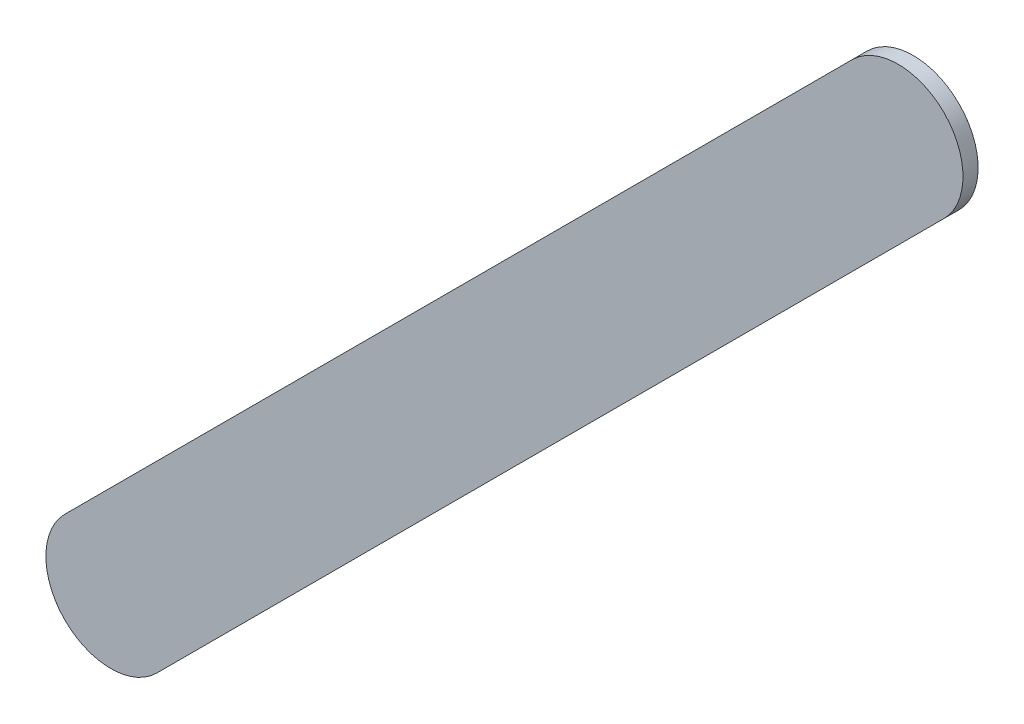
ISO-10303-21;
HEADER;
FILE_DESCRIPTION(('STEP AP214'),'2;1');
FILE_NAME('part.step','',(''),(''),'','','');
FILE_SCHEMA(('AUTOMOTIVE_DESIGN { 1 0 10303 214 1 1 1 1 }'));
ENDSEC;
DATA;
#1=APPLICATION_CONTEXT('core data for automotive mechanical design processes');
#2=APPLICATION_PROTOCOL_DEFINITION('international standard','automotive_design',2000,#1);
#3=PRODUCT_CONTEXT('',#1,'mechanical');
#4=PRODUCT('Part','Part','',(#3));
#5=PRODUCT_RELATED_PRODUCT_CATEGORY('part','',(#4));
#6=PRODUCT_DEFINITION_FORMATION('','',#4);
#7=PRODUCT_DEFINITION_CONTEXT('part definition',#1,'design');
#8=PRODUCT_DEFINITION('design','',#6,#7);
#9=PRODUCT_DEFINITION_SHAPE('','',#8);
#10=(LENGTH_UNIT() NAMED_UNIT(*) SI_UNIT(.MILLI.,.METRE.));
#11=(NAMED_UNIT(*) PLANE_ANGLE_UNIT() SI_UNIT($,.RADIAN.));
#12=(NAMED_UNIT(*) SI_UNIT($,.STERADIAN.) SOLID_ANGLE_UNIT());
#13=UNCERTAINTY_MEASURE_WITH_UNIT(LENGTH_MEASURE(1.E-05),#10,'distance_accuracy_value','');
#14=(GEOMETRIC_REPRESENTATION_CONTEXT(3) GLOBAL_UNCERTAINTY_ASSIGNED_CONTEXT((#13)) GLOBAL_UNIT_ASSIGNED_CONTEXT((#10,
#11,#12)) REPRESENTATION_CONTEXT('',''));
#15=CARTESIAN_POINT('',(0.,0.,0.));
#16=DIRECTION('',(0.,0.,1.));
#17=DIRECTION('',(1.,0.,0.));
#18=AXIS2_PLACEMENT_3D('',#15,#16,#17);
#19=CARTESIAN_POINT('',(148.076066,-54.846066,1.635));
#20=DIRECTION('',(0.,0.,1.));
#21=DIRECTION('',(1.,0.,0.));
#22=AXIS2_PLACEMENT_3D('',#19,#20,#21);
#23=PLANE('',#22);
#24=DIRECTION('',(0.707106781186548,0.707106781186548,0.));
#25=VECTOR('',#24,1.);
#26=CARTESIAN_POINT('',(148.076066,-54.846066,1.635));
#27=LINE('',#26,#25);
#28=CARTESIAN_POINT('',(148.076066,-54.846066,1.635));
#29=VERTEX_POINT('',#28);
#30=CARTESIAN_POINT('',(149.896067,-53.026065,1.635));
#31=VERTEX_POINT('',#30);
#32=EDGE_CURVE('E72',#29,#31,#27,.T.);
#33=ORIENTED_EDGE('',*,*,#32,.T.);
#34=CARTESIAN_POINT('',(149.7900005,-52.9199985,1.635));
#35=DIRECTION('',(0.,0.,1.));
#36=DIRECTION('',(0.707106781186548,-0.707106781186548,0.));
#37=AXIS2_PLACEMENT_3D('',#34,#35,#36);
#38=CIRCLE('',#37,0.150000682813);
#39=CARTESIAN_POINT('',(149.683934,-52.813932,1.635));
#40=VERTEX_POINT('',#39);
#41=EDGE_CURVE('E100',#31,#40,#38,.T.);
#42=ORIENTED_EDGE('',*,*,#41,.T.);
#43=DIRECTION('',(-0.707106781186548,-0.707106781186548,0.));
#44=VECTOR('',#43,1.);
#45=CARTESIAN_POINT('',(149.683934,-52.813932,1.635));
#46=LINE('',#45,#44);
#47=CARTESIAN_POINT('',(147.863933,-54.633933,1.635));
#48=VERTEX_POINT('',#47);
#49=EDGE_CURVE('E74',#40,#48,#46,.T.);
#50=ORIENTED_EDGE('',*,*,#49,.T.);
#51=CARTESIAN_POINT('',(147.9699995,-54.7399995,1.635));
#52=DIRECTION('',(0.,0.,1.));
#53=DIRECTION('',(-0.707106781186548,0.707106781186548,0.));
#54=AXIS2_PLACEMENT_3D('',#51,#52,#53);
#55=CIRCLE('',#54,0.150000682813);
#56=EDGE_CURVE('E11',#48,#29,#55,.T.);
#57=ORIENTED_EDGE('',*,*,#56,.T.);
#58=EDGE_LOOP('',(#33,#42,#50,#57));
#59=FACE_BOUND('',#58,.T.);
#60=ADVANCED_FACE('F17',(#59),#23,.T.);
#61=CARTESIAN_POINT('',(148.076066,-54.846066,1.6));
#62=DIRECTION('',(0.,0.,1.));
#63=DIRECTION('',(1.,0.,0.));
#64=AXIS2_PLACEMENT_3D('',#61,#62,#63);
#65=PLANE('',#64);
#66=CARTESIAN_POINT('',(147.9699995,-54.7399995,1.6));
#67=DIRECTION('',(0.,0.,1.));
#68=DIRECTION('',(-0.707106781186548,0.707106781186548,0.));
#69=AXIS2_PLACEMENT_3D('',#66,#67,#68);
#70=CIRCLE('',#69,0.150000682813);
#71=CARTESIAN_POINT('',(147.863933,-54.633933,1.6));
#72=VERTEX_POINT('',#71);
#73=CARTESIAN_POINT('',(148.076066,-54.846066,1.6));
#74=VERTEX_POINT('',#73);
#75=EDGE_CURVE('E26',#72,#74,#70,.T.);
#76=ORIENTED_EDGE('',*,*,#75,.F.);
#77=DIRECTION('',(-0.707106781186548,-0.707106781186548,0.));
#78=VECTOR('',#77,1.);
#79=CARTESIAN_POINT('',(149.683934,-52.813932,1.6));
#80=LINE('',#79,#78);
#81=CARTESIAN_POINT('',(149.683934,-52.813932,1.6));
#82=VERTEX_POINT('',#81);
#83=EDGE_CURVE('E102',#82,#72,#80,.T.);
#84=ORIENTED_EDGE('',*,*,#83,.F.);
#85=CARTESIAN_POINT('',(149.7900005,-52.9199985,1.6));
#86=DIRECTION('',(0.,0.,1.));
#87=DIRECTION('',(0.707106781186548,-0.707106781186548,0.));
#88=AXIS2_PLACEMENT_3D('',#85,#86,#87);
#89=CIRCLE('',#88,0.150000682813);
#90=CARTESIAN_POINT('',(149.896067,-53.026065,1.6));
#91=VERTEX_POINT('',#90);
#92=EDGE_CURVE('E82',#91,#82,#89,.T.);
#93=ORIENTED_EDGE('',*,*,#92,.F.);
#94=DIRECTION('',(0.707106781186548,0.707106781186548,0.));
#95=VECTOR('',#94,1.);
#96=CARTESIAN_POINT('',(148.076066,-54.846066,1.6));
#97=LINE('',#96,#95);
#98=EDGE_CURVE('E93',#74,#91,#97,.T.);
#99=ORIENTED_EDGE('',*,*,#98,.F.);
#100=EDGE_LOOP('',(#76,#84,#93,#99));
#101=FACE_BOUND('',#100,.T.);
#102=ADVANCED_FACE('F189',(#101),#65,.F.);
#103=CARTESIAN_POINT('',(147.9699995,-54.7399995,1.6));
#104=DIRECTION('',(0.,0.,-1.));
#105=DIRECTION('',(-0.707106781186548,0.707106781186548,0.));
#106=AXIS2_PLACEMENT_3D('',#103,#104,#105);
#107=CYLINDRICAL_SURFACE('',#106,0.150000682813);
#108=ORIENTED_EDGE('',*,*,#75,.T.);
#109=DIRECTION('',(0.,0.,1.));
#110=VECTOR('',#109,1.);
#111=CARTESIAN_POINT('',(148.076066,-54.846066,1.6));
#112=LINE('',#111,#110);
#113=EDGE_CURVE('E77',#74,#29,#112,.T.);
#114=ORIENTED_EDGE('',*,*,#113,.T.);
#115=ORIENTED_EDGE('',*,*,#56,.F.);
#116=DIRECTION('',(0.,0.,1.));
#117=VECTOR('',#116,1.);
#118=CARTESIAN_POINT('',(147.863933,-54.633933,1.6));
#119=LINE('',#118,#117);
#120=EDGE_CURVE('E20',#72,#48,#119,.T.);
#121=ORIENTED_EDGE('',*,*,#120,.F.);
#122=EDGE_LOOP('',(#108,#114,#115,#121));
#123=FACE_BOUND('',#122,.T.);
#124=ADVANCED_FACE('F78',(#123),#107,.T.);
#125=CARTESIAN_POINT('',(149.683934,-52.813932,1.6));
#126=DIRECTION('',(0.707106781186548,-0.707106781186548,0.));
#127=DIRECTION('',(0.,0.,-1.));
#128=AXIS2_PLACEMENT_3D('',#125,#126,#127);
#129=PLANE('',#128);
#130=ORIENTED_EDGE('',*,*,#83,.T.);
#131=ORIENTED_EDGE('',*,*,#120,.T.);
#132=ORIENTED_EDGE('',*,*,#49,.F.);
#133=DIRECTION('',(0.,0.,1.));
#134=VECTOR('',#133,1.);
#135=CARTESIAN_POINT('',(149.683934,-52.813932,1.6));
#136=LINE('',#135,#134);
#137=EDGE_CURVE('E97',#82,#40,#136,.T.);
#138=ORIENTED_EDGE('',*,*,#137,.F.);
#139=EDGE_LOOP('',(#130,#131,#132,#138));
#140=FACE_BOUND('',#139,.T.);
#141=ADVANCED_FACE('F117',(#140),#129,.F.);
#142=CARTESIAN_POINT('',(149.7900005,-52.9199985,1.6));
#143=DIRECTION('',(0.,0.,-1.));
#144=DIRECTION('',(0.707106781186548,-0.707106781186548,0.));
#145=AXIS2_PLACEMENT_3D('',#142,#143,#144);
#146=CYLINDRICAL_SURFACE('',#145,0.150000682813);
#147=ORIENTED_EDGE('',*,*,#92,.T.);
#148=ORIENTED_EDGE('',*,*,#137,.T.);
#149=ORIENTED_EDGE('',*,*,#41,.F.);
#150=DIRECTION('',(0.,0.,1.));
#151=VECTOR('',#150,1.);
#152=CARTESIAN_POINT('',(149.896067,-53.026065,1.6));
#153=LINE('',#152,#151);
#154=EDGE_CURVE('E86',#91,#31,#153,.T.);
#155=ORIENTED_EDGE('',*,*,#154,.F.);
#156=EDGE_LOOP('',(#147,#148,#149,#155));
#157=FACE_BOUND('',#156,.T.);
#158=ADVANCED_FACE('F115',(#157),#146,.T.);
#159=CARTESIAN_POINT('',(148.076066,-54.846066,1.6));
#160=DIRECTION('',(-0.707106781186548,0.707106781186548,0.));
#161=DIRECTION('',(0.,0.,1.));
#162=AXIS2_PLACEMENT_3D('',#159,#160,#161);
#163=PLANE('',#162);
#164=ORIENTED_EDGE('',*,*,#98,.T.);
#165=ORIENTED_EDGE('',*,*,#154,.T.);
#166=ORIENTED_EDGE('',*,*,#32,.F.);
#167=ORIENTED_EDGE('',*,*,#113,.F.);
#168=EDGE_LOOP('',(#164,#165,#166,#167));
#169=FACE_BOUND('',#168,.T.);
#170=ADVANCED_FACE('F84',(#169),#163,.F.);
#171=CLOSED_SHELL('',(#60,#102,#124,#141,#158,#170));
#172=MANIFOLD_SOLID_BREP('B1',#171);
#173=ADVANCED_BREP_SHAPE_REPRESENTATION('',(#18,#172),#14);
#174=SHAPE_DEFINITION_REPRESENTATION(#9,#173);
ENDSEC;
END-ISO-10303-21;
